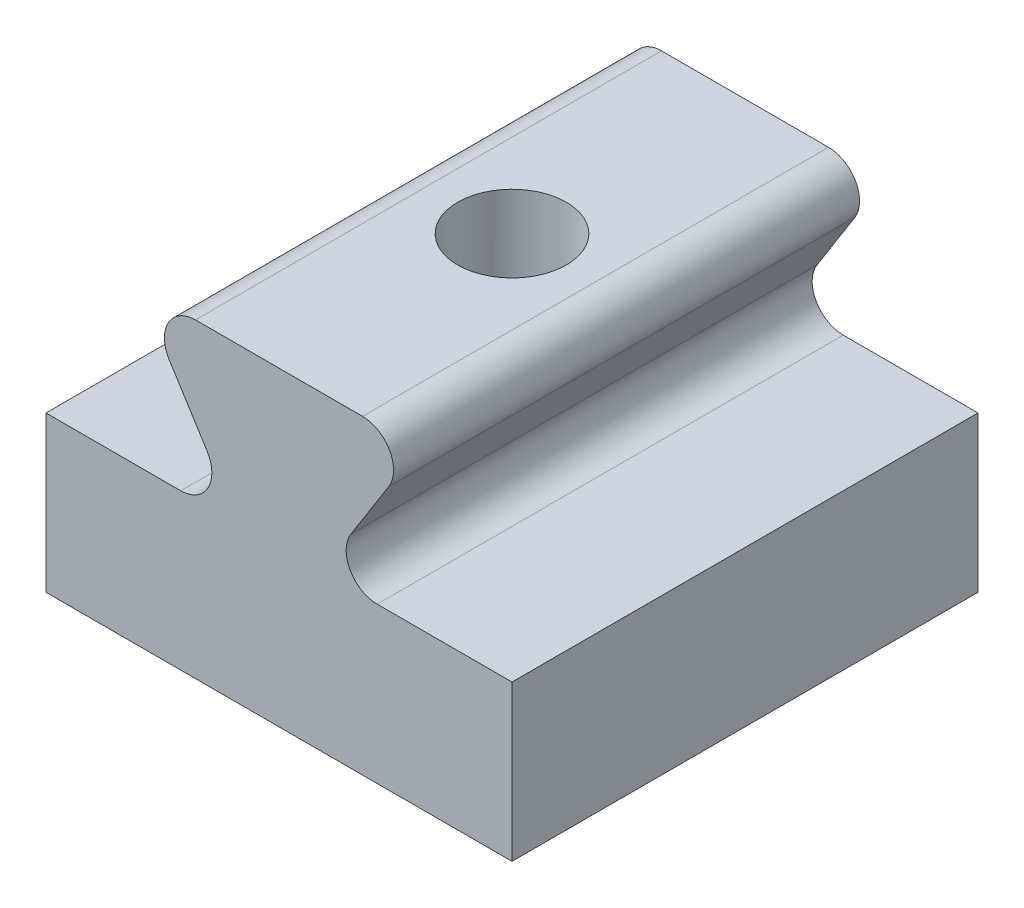
ISO-10303-21;
HEADER;
FILE_DESCRIPTION(('STEP AP214'),'2;1');
FILE_NAME('part.step','',(''),(''),'','','');
FILE_SCHEMA(('AUTOMOTIVE_DESIGN { 1 0 10303 214 1 1 1 1 }'));
ENDSEC;
DATA;
#1=APPLICATION_CONTEXT('core data for automotive mechanical design processes');
#2=APPLICATION_PROTOCOL_DEFINITION('international standard','automotive_design',2000,#1);
#3=PRODUCT_CONTEXT('',#1,'mechanical');
#4=PRODUCT('Part','Part','',(#3));
#5=PRODUCT_RELATED_PRODUCT_CATEGORY('part','',(#4));
#6=PRODUCT_DEFINITION_FORMATION('','',#4);
#7=PRODUCT_DEFINITION_CONTEXT('part definition',#1,'design');
#8=PRODUCT_DEFINITION('design','',#6,#7);
#9=PRODUCT_DEFINITION_SHAPE('','',#8);
#10=(LENGTH_UNIT() NAMED_UNIT(*) SI_UNIT(.MILLI.,.METRE.));
#11=(NAMED_UNIT(*) PLANE_ANGLE_UNIT() SI_UNIT($,.RADIAN.));
#12=(NAMED_UNIT(*) SI_UNIT($,.STERADIAN.) SOLID_ANGLE_UNIT());
#13=UNCERTAINTY_MEASURE_WITH_UNIT(LENGTH_MEASURE(1.E-05),#10,'distance_accuracy_value','');
#14=(GEOMETRIC_REPRESENTATION_CONTEXT(3) GLOBAL_UNCERTAINTY_ASSIGNED_CONTEXT((#13)) GLOBAL_UNIT_ASSIGNED_CONTEXT((#10,
#11,#12)) REPRESENTATION_CONTEXT('',''));
#15=CARTESIAN_POINT('',(0.,0.,0.));
#16=DIRECTION('',(0.,0.,1.));
#17=DIRECTION('',(1.,0.,0.));
#18=AXIS2_PLACEMENT_3D('',#15,#16,#17);
#19=CARTESIAN_POINT('',(7.5,0.,15.));
#20=DIRECTION('',(1.,0.,0.));
#21=DIRECTION('',(0.,1.,0.));
#22=AXIS2_PLACEMENT_3D('',#19,#20,#21);
#23=PLANE('',#22);
#24=DIRECTION('',(0.,-1.,0.));
#25=VECTOR('',#24,1.);
#26=CARTESIAN_POINT('',(7.5,0.,0.));
#27=LINE('',#26,#25);
#28=CARTESIAN_POINT('',(7.5,0.,0.));
#29=VERTEX_POINT('',#28);
#30=CARTESIAN_POINT('',(7.5,-5.,0.));
#31=VERTEX_POINT('',#30);
#32=EDGE_CURVE('E140',#29,#31,#27,.T.);
#33=ORIENTED_EDGE('',*,*,#32,.F.);
#34=DIRECTION('',(0.,0.,-1.));
#35=VECTOR('',#34,1.);
#36=CARTESIAN_POINT('',(7.5,0.,15.));
#37=LINE('',#36,#35);
#38=CARTESIAN_POINT('',(7.5,0.,15.));
#39=VERTEX_POINT('',#38);
#40=EDGE_CURVE('E128',#39,#29,#37,.T.);
#41=ORIENTED_EDGE('',*,*,#40,.F.);
#42=DIRECTION('',(0.,-1.,0.));
#43=VECTOR('',#42,1.);
#44=CARTESIAN_POINT('',(7.5,0.,15.));
#45=LINE('',#44,#43);
#46=CARTESIAN_POINT('',(7.5,-5.,15.));
#47=VERTEX_POINT('',#46);
#48=EDGE_CURVE('E134',#39,#47,#45,.T.);
#49=ORIENTED_EDGE('',*,*,#48,.T.);
#50=DIRECTION('',(0.,0.,-1.));
#51=VECTOR('',#50,1.);
#52=CARTESIAN_POINT('',(7.5,-5.,15.));
#53=LINE('',#52,#51);
#54=EDGE_CURVE('E167',#47,#31,#53,.T.);
#55=ORIENTED_EDGE('',*,*,#54,.T.);
#56=EDGE_LOOP('',(#33,#41,#49,#55));
#57=FACE_BOUND('',#56,.T.);
#58=ADVANCED_FACE('F35',(#57),#23,.T.);
#59=CARTESIAN_POINT('',(0.,0.,15.));
#60=DIRECTION('',(0.,1.,0.));
#61=DIRECTION('',(-1.,0.,0.));
#62=AXIS2_PLACEMENT_3D('',#59,#60,#61);
#63=PLANE('',#62);
#64=DIRECTION('',(1.,0.,0.));
#65=VECTOR('',#64,1.);
#66=CARTESIAN_POINT('',(0.,0.,0.));
#67=LINE('',#66,#65);
#68=CARTESIAN_POINT('',(3.16190524154858,0.,0.));
#69=VERTEX_POINT('',#68);
#70=EDGE_CURVE('E169',#69,#29,#67,.T.);
#71=ORIENTED_EDGE('',*,*,#70,.F.);
#72=DIRECTION('',(0.,0.,-1.));
#73=VECTOR('',#72,1.);
#74=CARTESIAN_POINT('',(3.16190524154858,0.,15.));
#75=LINE('',#74,#73);
#76=CARTESIAN_POINT('',(3.16190524154858,0.,15.));
#77=VERTEX_POINT('',#76);
#78=EDGE_CURVE('E131',#69,#77,#75,.F.);
#79=ORIENTED_EDGE('',*,*,#78,.T.);
#80=DIRECTION('',(1.,0.,0.));
#81=VECTOR('',#80,1.);
#82=CARTESIAN_POINT('',(0.,0.,15.));
#83=LINE('',#82,#81);
#84=EDGE_CURVE('E124',#77,#39,#83,.T.);
#85=ORIENTED_EDGE('',*,*,#84,.T.);
#86=ORIENTED_EDGE('',*,*,#40,.T.);
#87=EDGE_LOOP('',(#71,#79,#85,#86));
#88=FACE_BOUND('',#87,.T.);
#89=ADVANCED_FACE('F127',(#88),#63,.T.);
#90=CARTESIAN_POINT('',(0.966425656811512,-0.608848163791252,15.));
#91=DIRECTION('',(0.846091518038927,-0.533037656364524,0.));
#92=DIRECTION('',(0.533037656364524,0.846091518038927,0.));
#93=AXIS2_PLACEMENT_3D('',#90,#91,#92);
#94=PLANE('',#93);
#95=DIRECTION('',(-0.533037656364524,-0.846091518038927,0.));
#96=VECTOR('',#95,1.);
#97=CARTESIAN_POINT('',(0.966425656811512,-0.608848163791252,0.));
#98=LINE('',#97,#96);
#99=CARTESIAN_POINT('',(3.53418627649035,3.46696234363548,0.));
#100=VERTEX_POINT('',#99);
#101=CARTESIAN_POINT('',(2.31581372350965,1.53303765636452,0.));
#102=VERTEX_POINT('',#101);
#103=EDGE_CURVE('E171',#100,#102,#98,.T.);
#104=ORIENTED_EDGE('',*,*,#103,.F.);
#105=DIRECTION('',(0.,0.,-1.));
#106=VECTOR('',#105,1.);
#107=CARTESIAN_POINT('',(3.53418627649035,3.46696234363548,15.));
#108=LINE('',#107,#106);
#109=CARTESIAN_POINT('',(3.53418627649035,3.46696234363548,15.));
#110=VERTEX_POINT('',#109);
#111=EDGE_CURVE('E56',#100,#110,#108,.F.);
#112=ORIENTED_EDGE('',*,*,#111,.T.);
#113=DIRECTION('',(-0.533037656364524,-0.846091518038927,0.));
#114=VECTOR('',#113,1.);
#115=CARTESIAN_POINT('',(0.966425656811512,-0.608848163791252,15.));
#116=LINE('',#115,#114);
#117=CARTESIAN_POINT('',(2.31581372350965,1.53303765636452,15.));
#118=VERTEX_POINT('',#117);
#119=EDGE_CURVE('E133',#110,#118,#116,.T.);
#120=ORIENTED_EDGE('',*,*,#119,.T.);
#121=DIRECTION('',(0.,0.,-1.));
#122=VECTOR('',#121,1.);
#123=CARTESIAN_POINT('',(2.31581372350965,1.53303765636452,0.));
#124=LINE('',#123,#122);
#125=EDGE_CURVE('E207',#118,#102,#124,.T.);
#126=ORIENTED_EDGE('',*,*,#125,.T.);
#127=EDGE_LOOP('',(#104,#112,#120,#126));
#128=FACE_BOUND('',#127,.T.);
#129=ADVANCED_FACE('F220',(#128),#94,.T.);
#130=CARTESIAN_POINT('',(0.,5.,15.));
#131=DIRECTION('',(0.,1.,0.));
#132=DIRECTION('',(0.,0.,1.));
#133=AXIS2_PLACEMENT_3D('',#130,#131,#132);
#134=PLANE('',#133);
#135=CARTESIAN_POINT('',(0.,5.,7.5));
#136=DIRECTION('',(0.,1.,0.));
#137=DIRECTION('',(0.,0.,1.));
#138=AXIS2_PLACEMENT_3D('',#135,#136,#137);
#139=CIRCLE('',#138,1.75);
#140=CARTESIAN_POINT('',(0.,5.,9.25));
#141=VERTEX_POINT('',#140);
#142=EDGE_CURVE('E155',#141,#141,#139,.T.);
#143=ORIENTED_EDGE('',*,*,#142,.F.);
#144=EDGE_LOOP('',(#143));
#145=FACE_BOUND('',#144,.T.);
#146=DIRECTION('',(1.,0.,0.));
#147=VECTOR('',#146,1.);
#148=CARTESIAN_POINT('',(0.,5.,0.));
#149=LINE('',#148,#147);
#150=CARTESIAN_POINT('',(-2.68809475845142,5.,0.));
#151=VERTEX_POINT('',#150);
#152=CARTESIAN_POINT('',(2.68809475845142,5.,0.));
#153=VERTEX_POINT('',#152);
#154=EDGE_CURVE('E175',#151,#153,#149,.T.);
#155=ORIENTED_EDGE('',*,*,#154,.F.);
#156=DIRECTION('',(0.,0.,-1.));
#157=VECTOR('',#156,1.);
#158=CARTESIAN_POINT('',(-2.68809475845142,5.,15.));
#159=LINE('',#158,#157);
#160=CARTESIAN_POINT('',(-2.68809475845142,5.,15.));
#161=VERTEX_POINT('',#160);
#162=EDGE_CURVE('E201',#151,#161,#159,.F.);
#163=ORIENTED_EDGE('',*,*,#162,.T.);
#164=DIRECTION('',(1.,0.,0.));
#165=VECTOR('',#164,1.);
#166=CARTESIAN_POINT('',(0.,5.,15.));
#167=LINE('',#166,#165);
#168=CARTESIAN_POINT('',(2.68809475845142,5.,15.));
#169=VERTEX_POINT('',#168);
#170=EDGE_CURVE('E158',#161,#169,#167,.T.);
#171=ORIENTED_EDGE('',*,*,#170,.T.);
#172=DIRECTION('',(0.,0.,-1.));
#173=VECTOR('',#172,1.);
#174=CARTESIAN_POINT('',(2.68809475845142,5.,15.));
#175=LINE('',#174,#173);
#176=EDGE_CURVE('E198',#169,#153,#175,.T.);
#177=ORIENTED_EDGE('',*,*,#176,.T.);
#178=EDGE_LOOP('',(#155,#163,#171,#177));
#179=FACE_BOUND('',#178,.T.);
#180=ADVANCED_FACE('F227',(#145,#179),#134,.T.);
#181=CARTESIAN_POINT('',(-0.966425656811511,-0.608848163791252,15.));
#182=DIRECTION('',(-0.846091518038927,-0.533037656364524,0.));
#183=DIRECTION('',(0.533037656364524,-0.846091518038927,0.));
#184=AXIS2_PLACEMENT_3D('',#181,#182,#183);
#185=PLANE('',#184);
#186=DIRECTION('',(-0.533037656364524,0.846091518038927,0.));
#187=VECTOR('',#186,1.);
#188=CARTESIAN_POINT('',(-0.966425656811511,-0.608848163791252,0.));
#189=LINE('',#188,#187);
#190=CARTESIAN_POINT('',(-2.31581372350965,1.53303765636452,0.));
#191=VERTEX_POINT('',#190);
#192=CARTESIAN_POINT('',(-3.53418627649035,3.46696234363548,0.));
#193=VERTEX_POINT('',#192);
#194=EDGE_CURVE('E178',#191,#193,#189,.T.);
#195=ORIENTED_EDGE('',*,*,#194,.F.);
#196=DIRECTION('',(0.,0.,-1.));
#197=VECTOR('',#196,1.);
#198=CARTESIAN_POINT('',(-2.31581372350965,1.53303765636452,15.));
#199=LINE('',#198,#197);
#200=CARTESIAN_POINT('',(-2.31581372350965,1.53303765636452,15.));
#201=VERTEX_POINT('',#200);
#202=EDGE_CURVE('E192',#191,#201,#199,.F.);
#203=ORIENTED_EDGE('',*,*,#202,.T.);
#204=DIRECTION('',(-0.533037656364524,0.846091518038927,0.));
#205=VECTOR('',#204,1.);
#206=CARTESIAN_POINT('',(-0.966425656811511,-0.608848163791252,15.));
#207=LINE('',#206,#205);
#208=CARTESIAN_POINT('',(-3.53418627649035,3.46696234363548,15.));
#209=VERTEX_POINT('',#208);
#210=EDGE_CURVE('E161',#201,#209,#207,.T.);
#211=ORIENTED_EDGE('',*,*,#210,.T.);
#212=DIRECTION('',(0.,0.,-1.));
#213=VECTOR('',#212,1.);
#214=CARTESIAN_POINT('',(-3.53418627649035,3.46696234363548,15.));
#215=LINE('',#214,#213);
#216=EDGE_CURVE('E189',#209,#193,#215,.T.);
#217=ORIENTED_EDGE('',*,*,#216,.T.);
#218=EDGE_LOOP('',(#195,#203,#211,#217));
#219=FACE_BOUND('',#218,.T.);
#220=ADVANCED_FACE('F235',(#219),#185,.T.);
#221=CARTESIAN_POINT('',(-7.5,0.,15.));
#222=VERTEX_POINT('',#221);
#223=CARTESIAN_POINT('',(-3.16190524154858,0.,15.));
#224=VERTEX_POINT('',#223);
#225=EDGE_CURVE('E136',#222,#224,#83,.T.);
#226=ORIENTED_EDGE('',*,*,#225,.T.);
#227=DIRECTION('',(0.,0.,-1.));
#228=VECTOR('',#227,1.);
#229=CARTESIAN_POINT('',(-3.16190524154858,0.,0.));
#230=LINE('',#229,#228);
#231=CARTESIAN_POINT('',(-3.16190524154858,0.,0.));
#232=VERTEX_POINT('',#231);
#233=EDGE_CURVE('E141',#224,#232,#230,.T.);
#234=ORIENTED_EDGE('',*,*,#233,.T.);
#235=CARTESIAN_POINT('',(-7.5,0.,0.));
#236=VERTEX_POINT('',#235);
#237=EDGE_CURVE('E172',#236,#232,#67,.T.);
#238=ORIENTED_EDGE('',*,*,#237,.F.);
#239=DIRECTION('',(0.,0.,-1.));
#240=VECTOR('',#239,1.);
#241=CARTESIAN_POINT('',(-7.5,0.,15.));
#242=LINE('',#241,#240);
#243=EDGE_CURVE('E142',#222,#236,#242,.T.);
#244=ORIENTED_EDGE('',*,*,#243,.F.);
#245=EDGE_LOOP('',(#226,#234,#238,#244));
#246=FACE_BOUND('',#245,.T.);
#247=ADVANCED_FACE('F247',(#246),#63,.T.);
#248=CARTESIAN_POINT('',(-7.5,0.,15.));
#249=DIRECTION('',(1.,0.,0.));
#250=DIRECTION('',(0.,1.,0.));
#251=AXIS2_PLACEMENT_3D('',#248,#249,#250);
#252=PLANE('',#251);
#253=DIRECTION('',(0.,-1.,0.));
#254=VECTOR('',#253,1.);
#255=CARTESIAN_POINT('',(-7.5,0.,0.));
#256=LINE('',#255,#254);
#257=CARTESIAN_POINT('',(-7.5,-5.,0.));
#258=VERTEX_POINT('',#257);
#259=EDGE_CURVE('E152',#236,#258,#256,.T.);
#260=ORIENTED_EDGE('',*,*,#259,.T.);
#261=DIRECTION('',(0.,0.,-1.));
#262=VECTOR('',#261,1.);
#263=CARTESIAN_POINT('',(-7.5,-5.,15.));
#264=LINE('',#263,#262);
#265=CARTESIAN_POINT('',(-7.5,-5.,15.));
#266=VERTEX_POINT('',#265);
#267=EDGE_CURVE('E183',#266,#258,#264,.T.);
#268=ORIENTED_EDGE('',*,*,#267,.F.);
#269=DIRECTION('',(0.,-1.,0.));
#270=VECTOR('',#269,1.);
#271=CARTESIAN_POINT('',(-7.5,0.,15.));
#272=LINE('',#271,#270);
#273=EDGE_CURVE('E164',#222,#266,#272,.T.);
#274=ORIENTED_EDGE('',*,*,#273,.F.);
#275=ORIENTED_EDGE('',*,*,#243,.T.);
#276=EDGE_LOOP('',(#260,#268,#274,#275));
#277=FACE_BOUND('',#276,.T.);
#278=ADVANCED_FACE('F252',(#277),#252,.F.);
#279=CARTESIAN_POINT('',(0.,-5.,15.));
#280=DIRECTION('',(0.,1.,0.));
#281=DIRECTION('',(-1.,0.,0.));
#282=AXIS2_PLACEMENT_3D('',#279,#280,#281);
#283=PLANE('',#282);
#284=CARTESIAN_POINT('',(0.,-5.,7.5));
#285=DIRECTION('',(0.,1.,0.));
#286=DIRECTION('',(-1.,0.,0.));
#287=AXIS2_PLACEMENT_3D('',#284,#285,#286);
#288=CIRCLE('',#287,1.75);
#289=CARTESIAN_POINT('',(-1.75,-5.,7.5));
#290=VERTEX_POINT('',#289);
#291=EDGE_CURVE('E39',#290,#290,#288,.T.);
#292=ORIENTED_EDGE('',*,*,#291,.T.);
#293=EDGE_LOOP('',(#292));
#294=FACE_BOUND('',#293,.T.);
#295=DIRECTION('',(1.,0.,0.));
#296=VECTOR('',#295,1.);
#297=CARTESIAN_POINT('',(0.,-5.,0.));
#298=LINE('',#297,#296);
#299=EDGE_CURVE('E149',#258,#31,#298,.T.);
#300=ORIENTED_EDGE('',*,*,#299,.T.);
#301=ORIENTED_EDGE('',*,*,#54,.F.);
#302=DIRECTION('',(1.,0.,0.));
#303=VECTOR('',#302,1.);
#304=CARTESIAN_POINT('',(0.,-5.,15.));
#305=LINE('',#304,#303);
#306=EDGE_CURVE('E147',#266,#47,#305,.T.);
#307=ORIENTED_EDGE('',*,*,#306,.F.);
#308=ORIENTED_EDGE('',*,*,#267,.T.);
#309=EDGE_LOOP('',(#300,#301,#307,#308));
#310=FACE_BOUND('',#309,.T.);
#311=ADVANCED_FACE('F255',(#294,#310),#283,.F.);
#312=CARTESIAN_POINT('',(0.,0.,15.));
#313=DIRECTION('',(0.,0.,1.));
#314=DIRECTION('',(1.,0.,0.));
#315=AXIS2_PLACEMENT_3D('',#312,#313,#314);
#316=PLANE('',#315);
#317=ORIENTED_EDGE('',*,*,#170,.F.);
#318=CARTESIAN_POINT('',(-2.68809475845142,4.,15.));
#319=DIRECTION('',(0.,0.,1.));
#320=DIRECTION('',(1.,0.,0.));
#321=AXIS2_PLACEMENT_3D('',#318,#319,#320);
#322=CIRCLE('',#321,1.);
#323=EDGE_CURVE('E205',#161,#209,#322,.T.);
#324=ORIENTED_EDGE('',*,*,#323,.T.);
#325=ORIENTED_EDGE('',*,*,#210,.F.);
#326=CARTESIAN_POINT('',(-3.16190524154858,1.,15.));
#327=DIRECTION('',(0.,0.,1.));
#328=DIRECTION('',(1.,0.,0.));
#329=AXIS2_PLACEMENT_3D('',#326,#327,#328);
#330=CIRCLE('',#329,1.);
#331=EDGE_CURVE('E214',#201,#224,#330,.F.);
#332=ORIENTED_EDGE('',*,*,#331,.T.);
#333=ORIENTED_EDGE('',*,*,#225,.F.);
#334=ORIENTED_EDGE('',*,*,#273,.T.);
#335=ORIENTED_EDGE('',*,*,#306,.T.);
#336=ORIENTED_EDGE('',*,*,#48,.F.);
#337=ORIENTED_EDGE('',*,*,#84,.F.);
#338=CARTESIAN_POINT('',(3.16190524154858,1.,15.));
#339=DIRECTION('',(0.,0.,1.));
#340=DIRECTION('',(1.,0.,0.));
#341=AXIS2_PLACEMENT_3D('',#338,#339,#340);
#342=CIRCLE('',#341,1.);
#343=EDGE_CURVE('E11',#77,#118,#342,.F.);
#344=ORIENTED_EDGE('',*,*,#343,.T.);
#345=ORIENTED_EDGE('',*,*,#119,.F.);
#346=CARTESIAN_POINT('',(2.68809475845142,4.,15.));
#347=DIRECTION('',(0.,0.,1.));
#348=DIRECTION('',(1.,0.,0.));
#349=AXIS2_PLACEMENT_3D('',#346,#347,#348);
#350=CIRCLE('',#349,1.);
#351=EDGE_CURVE('E203',#110,#169,#350,.T.);
#352=ORIENTED_EDGE('',*,*,#351,.T.);
#353=EDGE_LOOP('',(#317,#324,#325,#332,#333,#334,#335,#336,#337,#344,#345,#352));
#354=FACE_BOUND('',#353,.T.);
#355=ADVANCED_FACE('F145',(#354),#316,.T.);
#356=CARTESIAN_POINT('',(0.,0.,0.));
#357=DIRECTION('',(0.,0.,1.));
#358=DIRECTION('',(1.,0.,0.));
#359=AXIS2_PLACEMENT_3D('',#356,#357,#358);
#360=PLANE('',#359);
#361=ORIENTED_EDGE('',*,*,#194,.T.);
#362=CARTESIAN_POINT('',(-2.68809475845142,4.,0.));
#363=DIRECTION('',(0.,0.,1.));
#364=DIRECTION('',(1.,0.,0.));
#365=AXIS2_PLACEMENT_3D('',#362,#363,#364);
#366=CIRCLE('',#365,1.);
#367=EDGE_CURVE('E196',#193,#151,#366,.F.);
#368=ORIENTED_EDGE('',*,*,#367,.T.);
#369=ORIENTED_EDGE('',*,*,#154,.T.);
#370=CARTESIAN_POINT('',(2.68809475845142,4.,0.));
#371=DIRECTION('',(0.,0.,1.));
#372=DIRECTION('',(1.,0.,0.));
#373=AXIS2_PLACEMENT_3D('',#370,#371,#372);
#374=CIRCLE('',#373,1.);
#375=EDGE_CURVE('E194',#153,#100,#374,.F.);
#376=ORIENTED_EDGE('',*,*,#375,.T.);
#377=ORIENTED_EDGE('',*,*,#103,.T.);
#378=CARTESIAN_POINT('',(3.16190524154858,1.,0.));
#379=DIRECTION('',(0.,0.,1.));
#380=DIRECTION('',(1.,0.,0.));
#381=AXIS2_PLACEMENT_3D('',#378,#379,#380);
#382=CIRCLE('',#381,1.);
#383=EDGE_CURVE('E44',#102,#69,#382,.T.);
#384=ORIENTED_EDGE('',*,*,#383,.T.);
#385=ORIENTED_EDGE('',*,*,#70,.T.);
#386=ORIENTED_EDGE('',*,*,#32,.T.);
#387=ORIENTED_EDGE('',*,*,#299,.F.);
#388=ORIENTED_EDGE('',*,*,#259,.F.);
#389=ORIENTED_EDGE('',*,*,#237,.T.);
#390=CARTESIAN_POINT('',(-3.16190524154858,1.,0.));
#391=DIRECTION('',(0.,0.,1.));
#392=DIRECTION('',(1.,0.,0.));
#393=AXIS2_PLACEMENT_3D('',#390,#391,#392);
#394=CIRCLE('',#393,1.);
#395=EDGE_CURVE('E212',#232,#191,#394,.T.);
#396=ORIENTED_EDGE('',*,*,#395,.T.);
#397=EDGE_LOOP('',(#361,#368,#369,#376,#377,#384,#385,#386,#387,#388,#389,#396));
#398=FACE_BOUND('',#397,.T.);
#399=ADVANCED_FACE('F217',(#398),#360,.F.);
#400=CARTESIAN_POINT('',(-3.16190524154858,1.,15.));
#401=DIRECTION('',(0.,0.,1.));
#402=DIRECTION('',(1.,0.,0.));
#403=AXIS2_PLACEMENT_3D('',#400,#401,#402);
#404=CYLINDRICAL_SURFACE('',#403,1.);
#405=ORIENTED_EDGE('',*,*,#331,.F.);
#406=ORIENTED_EDGE('',*,*,#202,.F.);
#407=ORIENTED_EDGE('',*,*,#395,.F.);
#408=ORIENTED_EDGE('',*,*,#233,.F.);
#409=EDGE_LOOP('',(#405,#406,#407,#408));
#410=FACE_BOUND('',#409,.T.);
#411=ADVANCED_FACE('F243',(#410),#404,.F.);
#412=CARTESIAN_POINT('',(-2.68809475845142,4.,15.));
#413=DIRECTION('',(0.,0.,-1.));
#414=DIRECTION('',(-1.,0.,0.));
#415=AXIS2_PLACEMENT_3D('',#412,#413,#414);
#416=CYLINDRICAL_SURFACE('',#415,1.);
#417=ORIENTED_EDGE('',*,*,#323,.F.);
#418=ORIENTED_EDGE('',*,*,#162,.F.);
#419=ORIENTED_EDGE('',*,*,#367,.F.);
#420=ORIENTED_EDGE('',*,*,#216,.F.);
#421=EDGE_LOOP('',(#417,#418,#419,#420));
#422=FACE_BOUND('',#421,.T.);
#423=ADVANCED_FACE('F233',(#422),#416,.T.);
#424=CARTESIAN_POINT('',(2.68809475845142,4.,15.));
#425=DIRECTION('',(0.,0.,-1.));
#426=DIRECTION('',(-1.,0.,0.));
#427=AXIS2_PLACEMENT_3D('',#424,#425,#426);
#428=CYLINDRICAL_SURFACE('',#427,1.);
#429=ORIENTED_EDGE('',*,*,#351,.F.);
#430=ORIENTED_EDGE('',*,*,#111,.F.);
#431=ORIENTED_EDGE('',*,*,#375,.F.);
#432=ORIENTED_EDGE('',*,*,#176,.F.);
#433=EDGE_LOOP('',(#429,#430,#431,#432));
#434=FACE_BOUND('',#433,.T.);
#435=ADVANCED_FACE('F224',(#434),#428,.T.);
#436=CARTESIAN_POINT('',(3.16190524154858,1.,15.));
#437=DIRECTION('',(0.,0.,1.));
#438=DIRECTION('',(1.,0.,0.));
#439=AXIS2_PLACEMENT_3D('',#436,#437,#438);
#440=CYLINDRICAL_SURFACE('',#439,1.);
#441=ORIENTED_EDGE('',*,*,#343,.F.);
#442=ORIENTED_EDGE('',*,*,#78,.F.);
#443=ORIENTED_EDGE('',*,*,#383,.F.);
#444=ORIENTED_EDGE('',*,*,#125,.F.);
#445=EDGE_LOOP('',(#441,#442,#443,#444));
#446=FACE_BOUND('',#445,.T.);
#447=ADVANCED_FACE('F37',(#446),#440,.F.);
#448=CARTESIAN_POINT('',(0.,-10.,7.5));
#449=DIRECTION('',(0.,1.,0.));
#450=DIRECTION('',(0.,0.,1.));
#451=AXIS2_PLACEMENT_3D('',#448,#449,#450);
#452=CYLINDRICAL_SURFACE('',#451,1.75);
#453=ORIENTED_EDGE('',*,*,#142,.T.);
#454=EDGE_LOOP('',(#453));
#455=FACE_BOUND('',#454,.T.);
#456=ORIENTED_EDGE('',*,*,#291,.F.);
#457=EDGE_LOOP('',(#456));
#458=FACE_BOUND('',#457,.T.);
#459=ADVANCED_FACE('F283',(#455,#458),#452,.F.);
#460=CLOSED_SHELL('',(#58,#89,#129,#180,#220,#247,#278,#311,#355,#399,#411,#423,#435,#447,#459));
#461=MANIFOLD_SOLID_BREP('B2',#460);
#462=ADVANCED_BREP_SHAPE_REPRESENTATION('',(#18,#461),#14);
#463=SHAPE_DEFINITION_REPRESENTATION(#9,#462);
ENDSEC;
END-ISO-10303-21;
